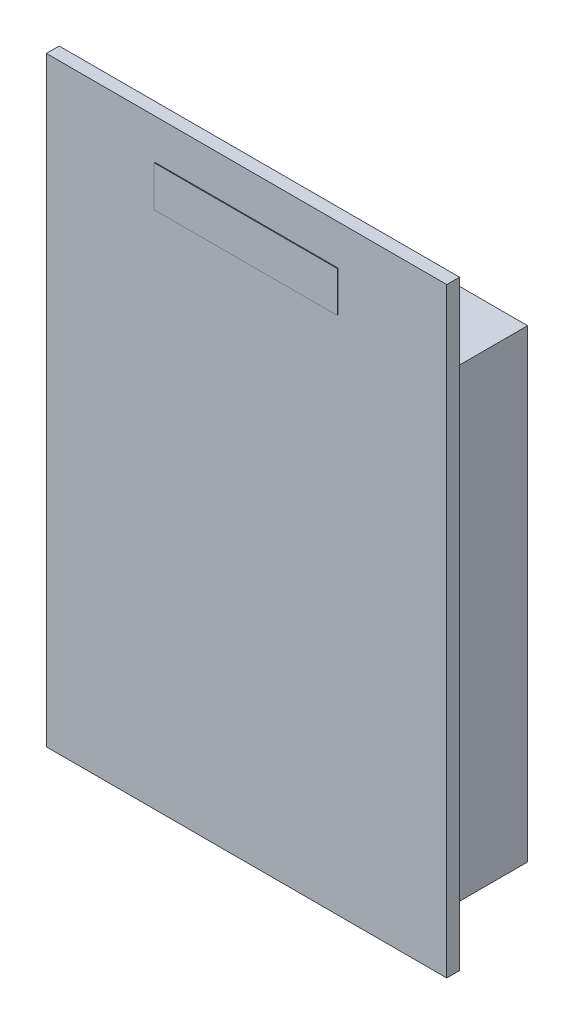
ISO-10303-21;
HEADER;
FILE_DESCRIPTION(('STEP AP214'),'2;1');
FILE_NAME('part.step','',(''),(''),'','','');
FILE_SCHEMA(('AUTOMOTIVE_DESIGN { 1 0 10303 214 1 1 1 1 }'));
ENDSEC;
DATA;
#1=APPLICATION_CONTEXT('core data for automotive mechanical design processes');
#2=APPLICATION_PROTOCOL_DEFINITION('international standard','automotive_design',2000,#1);
#3=PRODUCT_CONTEXT('',#1,'mechanical');
#4=PRODUCT('Part','Part','',(#3));
#5=PRODUCT_RELATED_PRODUCT_CATEGORY('part','',(#4));
#6=PRODUCT_DEFINITION_FORMATION('','',#4);
#7=PRODUCT_DEFINITION_CONTEXT('part definition',#1,'design');
#8=PRODUCT_DEFINITION('design','',#6,#7);
#9=PRODUCT_DEFINITION_SHAPE('','',#8);
#10=(LENGTH_UNIT() NAMED_UNIT(*) SI_UNIT(.MILLI.,.METRE.));
#11=(NAMED_UNIT(*) PLANE_ANGLE_UNIT() SI_UNIT($,.RADIAN.));
#12=(NAMED_UNIT(*) SI_UNIT($,.STERADIAN.) SOLID_ANGLE_UNIT());
#13=UNCERTAINTY_MEASURE_WITH_UNIT(LENGTH_MEASURE(1.E-05),#10,'distance_accuracy_value','');
#14=(GEOMETRIC_REPRESENTATION_CONTEXT(3) GLOBAL_UNCERTAINTY_ASSIGNED_CONTEXT((#13)) GLOBAL_UNIT_ASSIGNED_CONTEXT((#10,
#11,#12)) REPRESENTATION_CONTEXT('',''));
#15=CARTESIAN_POINT('',(0.,0.,0.));
#16=DIRECTION('',(0.,0.,1.));
#17=DIRECTION('',(1.,0.,0.));
#18=AXIS2_PLACEMENT_3D('',#15,#16,#17);
#19=CARTESIAN_POINT('',(0.,0.,0.));
#20=DIRECTION('',(0.,0.,1.));
#21=DIRECTION('',(1.,0.,0.));
#22=AXIS2_PLACEMENT_3D('',#19,#20,#21);
#23=PLANE('',#22);
#24=DIRECTION('',(0.,-1.,0.));
#25=VECTOR('',#24,1.);
#26=CARTESIAN_POINT('',(17.5,-37.5,0.));
#27=LINE('',#26,#25);
#28=CARTESIAN_POINT('',(17.5,20.5,0.));
#29=VERTEX_POINT('',#28);
#30=CARTESIAN_POINT('',(17.5,-37.5,0.));
#31=VERTEX_POINT('',#30);
#32=EDGE_CURVE('E57',#29,#31,#27,.T.);
#33=ORIENTED_EDGE('',*,*,#32,.F.);
#34=DIRECTION('',(1.,0.,0.));
#35=VECTOR('',#34,1.);
#36=CARTESIAN_POINT('',(-17.5,20.5,0.));
#37=LINE('',#36,#35);
#38=CARTESIAN_POINT('',(-17.5,20.5,0.));
#39=VERTEX_POINT('',#38);
#40=EDGE_CURVE('E151',#39,#29,#37,.T.);
#41=ORIENTED_EDGE('',*,*,#40,.F.);
#42=DIRECTION('',(0.,1.,0.));
#43=VECTOR('',#42,1.);
#44=CARTESIAN_POINT('',(-17.5,-37.5,0.));
#45=LINE('',#44,#43);
#46=CARTESIAN_POINT('',(-17.5,-37.5,0.));
#47=VERTEX_POINT('',#46);
#48=EDGE_CURVE('E258',#47,#39,#45,.T.);
#49=ORIENTED_EDGE('',*,*,#48,.F.);
#50=DIRECTION('',(1.,0.,0.));
#51=VECTOR('',#50,1.);
#52=CARTESIAN_POINT('',(25.,-37.5,0.));
#53=LINE('',#52,#51);
#54=CARTESIAN_POINT('',(-25.,-37.5,0.));
#55=VERTEX_POINT('',#54);
#56=EDGE_CURVE('E221',#55,#47,#53,.T.);
#57=ORIENTED_EDGE('',*,*,#56,.F.);
#58=DIRECTION('',(0.,-1.,0.));
#59=VECTOR('',#58,1.);
#60=CARTESIAN_POINT('',(-25.,-37.5,0.));
#61=LINE('',#60,#59);
#62=CARTESIAN_POINT('',(-25.,37.5,0.));
#63=VERTEX_POINT('',#62);
#64=EDGE_CURVE('E202',#63,#55,#61,.T.);
#65=ORIENTED_EDGE('',*,*,#64,.F.);
#66=DIRECTION('',(-1.,0.,0.));
#67=VECTOR('',#66,1.);
#68=CARTESIAN_POINT('',(25.,37.5,0.));
#69=LINE('',#68,#67);
#70=CARTESIAN_POINT('',(25.,37.5,0.));
#71=VERTEX_POINT('',#70);
#72=EDGE_CURVE('E208',#71,#63,#69,.T.);
#73=ORIENTED_EDGE('',*,*,#72,.F.);
#74=DIRECTION('',(0.,1.,0.));
#75=VECTOR('',#74,1.);
#76=CARTESIAN_POINT('',(25.,-37.5,0.));
#77=LINE('',#76,#75);
#78=CARTESIAN_POINT('',(25.,-37.5,0.));
#79=VERTEX_POINT('',#78);
#80=EDGE_CURVE('E224',#79,#71,#77,.T.);
#81=ORIENTED_EDGE('',*,*,#80,.F.);
#82=EDGE_CURVE('E62',#31,#79,#53,.T.);
#83=ORIENTED_EDGE('',*,*,#82,.F.);
#84=EDGE_LOOP('',(#33,#41,#49,#57,#65,#73,#81,#83));
#85=FACE_BOUND('',#84,.T.);
#86=ADVANCED_FACE('F41',(#85),#23,.F.);
#87=CARTESIAN_POINT('',(0.,0.,1.6));
#88=DIRECTION('',(0.,0.,1.));
#89=DIRECTION('',(1.,0.,0.));
#90=AXIS2_PLACEMENT_3D('',#87,#88,#89);
#91=PLANE('',#90);
#92=DIRECTION('',(0.,-1.,0.));
#93=VECTOR('',#92,1.);
#94=CARTESIAN_POINT('',(-25.,-37.5,1.6));
#95=LINE('',#94,#93);
#96=CARTESIAN_POINT('',(-25.,37.5,1.6));
#97=VERTEX_POINT('',#96);
#98=CARTESIAN_POINT('',(-25.,-37.5,1.6));
#99=VERTEX_POINT('',#98);
#100=EDGE_CURVE('E203',#97,#99,#95,.T.);
#101=ORIENTED_EDGE('',*,*,#100,.T.);
#102=DIRECTION('',(1.,0.,0.));
#103=VECTOR('',#102,1.);
#104=CARTESIAN_POINT('',(25.,-37.5,1.6));
#105=LINE('',#104,#103);
#106=CARTESIAN_POINT('',(25.,-37.5,1.6));
#107=VERTEX_POINT('',#106);
#108=EDGE_CURVE('E207',#99,#107,#105,.T.);
#109=ORIENTED_EDGE('',*,*,#108,.T.);
#110=DIRECTION('',(0.,1.,0.));
#111=VECTOR('',#110,1.);
#112=CARTESIAN_POINT('',(25.,-37.5,1.6));
#113=LINE('',#112,#111);
#114=CARTESIAN_POINT('',(25.,37.5,1.6));
#115=VERTEX_POINT('',#114);
#116=EDGE_CURVE('E211',#107,#115,#113,.T.);
#117=ORIENTED_EDGE('',*,*,#116,.T.);
#118=DIRECTION('',(-1.,0.,0.));
#119=VECTOR('',#118,1.);
#120=CARTESIAN_POINT('',(25.,37.5,1.6));
#121=LINE('',#120,#119);
#122=EDGE_CURVE('E214',#115,#97,#121,.T.);
#123=ORIENTED_EDGE('',*,*,#122,.T.);
#124=EDGE_LOOP('',(#101,#109,#117,#123));
#125=FACE_BOUND('',#124,.T.);
#126=DIRECTION('',(-1.,0.,0.));
#127=VECTOR('',#126,1.);
#128=CARTESIAN_POINT('',(-11.43,32.5,1.6));
#129=LINE('',#128,#127);
#130=CARTESIAN_POINT('',(11.43,32.5,1.6));
#131=VERTEX_POINT('',#130);
#132=CARTESIAN_POINT('',(-11.43,32.5,1.6));
#133=VERTEX_POINT('',#132);
#134=EDGE_CURVE('E160',#131,#133,#129,.T.);
#135=ORIENTED_EDGE('',*,*,#134,.F.);
#136=DIRECTION('',(0.,1.,0.));
#137=VECTOR('',#136,1.);
#138=CARTESIAN_POINT('',(11.43,27.42,1.6));
#139=LINE('',#138,#137);
#140=CARTESIAN_POINT('',(11.43,27.42,1.6));
#141=VERTEX_POINT('',#140);
#142=EDGE_CURVE('E155',#141,#131,#139,.T.);
#143=ORIENTED_EDGE('',*,*,#142,.F.);
#144=DIRECTION('',(1.,0.,0.));
#145=VECTOR('',#144,1.);
#146=CARTESIAN_POINT('',(-11.43,27.42,1.6));
#147=LINE('',#146,#145);
#148=CARTESIAN_POINT('',(-11.43,27.42,1.6));
#149=VERTEX_POINT('',#148);
#150=EDGE_CURVE('E171',#149,#141,#147,.T.);
#151=ORIENTED_EDGE('',*,*,#150,.F.);
#152=DIRECTION('',(0.,-1.,0.));
#153=VECTOR('',#152,1.);
#154=CARTESIAN_POINT('',(-11.43,27.42,1.6));
#155=LINE('',#154,#153);
#156=EDGE_CURVE('E183',#133,#149,#155,.T.);
#157=ORIENTED_EDGE('',*,*,#156,.F.);
#158=EDGE_LOOP('',(#135,#143,#151,#157));
#159=FACE_BOUND('',#158,.T.);
#160=ADVANCED_FACE('F252',(#125,#159),#91,.T.);
#161=CARTESIAN_POINT('',(-25.,-37.5,1.6));
#162=DIRECTION('',(1.,0.,0.));
#163=DIRECTION('',(0.,0.,-1.));
#164=AXIS2_PLACEMENT_3D('',#161,#162,#163);
#165=PLANE('',#164);
#166=ORIENTED_EDGE('',*,*,#64,.T.);
#167=DIRECTION('',(0.,0.,-1.));
#168=VECTOR('',#167,1.);
#169=CARTESIAN_POINT('',(-25.,-37.5,1.6));
#170=LINE('',#169,#168);
#171=EDGE_CURVE('E11',#99,#55,#170,.T.);
#172=ORIENTED_EDGE('',*,*,#171,.F.);
#173=ORIENTED_EDGE('',*,*,#100,.F.);
#174=DIRECTION('',(0.,0.,-1.));
#175=VECTOR('',#174,1.);
#176=CARTESIAN_POINT('',(-25.,37.5,1.6));
#177=LINE('',#176,#175);
#178=EDGE_CURVE('E217',#97,#63,#177,.T.);
#179=ORIENTED_EDGE('',*,*,#178,.T.);
#180=EDGE_LOOP('',(#166,#172,#173,#179));
#181=FACE_BOUND('',#180,.T.);
#182=ADVANCED_FACE('F43',(#181),#165,.F.);
#183=CARTESIAN_POINT('',(25.,-37.5,1.6));
#184=DIRECTION('',(0.,1.,0.));
#185=DIRECTION('',(0.,0.,1.));
#186=AXIS2_PLACEMENT_3D('',#183,#184,#185);
#187=PLANE('',#186);
#188=ORIENTED_EDGE('',*,*,#56,.T.);
#189=DIRECTION('',(0.,0.,1.));
#190=VECTOR('',#189,1.);
#191=CARTESIAN_POINT('',(-17.5,-37.5,-16.));
#192=LINE('',#191,#190);
#193=CARTESIAN_POINT('',(-17.5,-37.5,-16.));
#194=VERTEX_POINT('',#193);
#195=EDGE_CURVE('E136',#194,#47,#192,.T.);
#196=ORIENTED_EDGE('',*,*,#195,.F.);
#197=DIRECTION('',(-1.,0.,0.));
#198=VECTOR('',#197,1.);
#199=CARTESIAN_POINT('',(-17.5,-37.5,-16.));
#200=LINE('',#199,#198);
#201=CARTESIAN_POINT('',(17.5,-37.5,-16.));
#202=VERTEX_POINT('',#201);
#203=EDGE_CURVE('E129',#202,#194,#200,.T.);
#204=ORIENTED_EDGE('',*,*,#203,.F.);
#205=DIRECTION('',(0.,0.,1.));
#206=VECTOR('',#205,1.);
#207=CARTESIAN_POINT('',(17.5,-37.5,-16.));
#208=LINE('',#207,#206);
#209=EDGE_CURVE('E134',#202,#31,#208,.T.);
#210=ORIENTED_EDGE('',*,*,#209,.T.);
#211=ORIENTED_EDGE('',*,*,#82,.T.);
#212=DIRECTION('',(0.,0.,-1.));
#213=VECTOR('',#212,1.);
#214=CARTESIAN_POINT('',(25.,-37.5,1.6));
#215=LINE('',#214,#213);
#216=EDGE_CURVE('E50',#107,#79,#215,.T.);
#217=ORIENTED_EDGE('',*,*,#216,.F.);
#218=ORIENTED_EDGE('',*,*,#108,.F.);
#219=ORIENTED_EDGE('',*,*,#171,.T.);
#220=EDGE_LOOP('',(#188,#196,#204,#210,#211,#217,#218,#219));
#221=FACE_BOUND('',#220,.T.);
#222=ADVANCED_FACE('F132',(#221),#187,.F.);
#223=CARTESIAN_POINT('',(25.,-37.5,1.6));
#224=DIRECTION('',(-1.,0.,0.));
#225=DIRECTION('',(0.,0.,1.));
#226=AXIS2_PLACEMENT_3D('',#223,#224,#225);
#227=PLANE('',#226);
#228=ORIENTED_EDGE('',*,*,#80,.T.);
#229=DIRECTION('',(0.,0.,-1.));
#230=VECTOR('',#229,1.);
#231=CARTESIAN_POINT('',(25.,37.5,1.6));
#232=LINE('',#231,#230);
#233=EDGE_CURVE('E232',#115,#71,#232,.T.);
#234=ORIENTED_EDGE('',*,*,#233,.F.);
#235=ORIENTED_EDGE('',*,*,#116,.F.);
#236=ORIENTED_EDGE('',*,*,#216,.T.);
#237=EDGE_LOOP('',(#228,#234,#235,#236));
#238=FACE_BOUND('',#237,.T.);
#239=ADVANCED_FACE('F240',(#238),#227,.F.);
#240=CARTESIAN_POINT('',(25.,37.5,1.6));
#241=DIRECTION('',(0.,-1.,0.));
#242=DIRECTION('',(0.,0.,-1.));
#243=AXIS2_PLACEMENT_3D('',#240,#241,#242);
#244=PLANE('',#243);
#245=ORIENTED_EDGE('',*,*,#72,.T.);
#246=ORIENTED_EDGE('',*,*,#178,.F.);
#247=ORIENTED_EDGE('',*,*,#122,.F.);
#248=ORIENTED_EDGE('',*,*,#233,.T.);
#249=EDGE_LOOP('',(#245,#246,#247,#248));
#250=FACE_BOUND('',#249,.T.);
#251=ADVANCED_FACE('F246',(#250),#244,.F.);
#252=CARTESIAN_POINT('',(11.43,27.42,1.7));
#253=DIRECTION('',(-1.,0.,0.));
#254=DIRECTION('',(0.,0.,1.));
#255=AXIS2_PLACEMENT_3D('',#252,#253,#254);
#256=PLANE('',#255);
#257=ORIENTED_EDGE('',*,*,#142,.T.);
#258=DIRECTION('',(0.,0.,-1.));
#259=VECTOR('',#258,1.);
#260=CARTESIAN_POINT('',(11.43,32.5,1.7));
#261=LINE('',#260,#259);
#262=CARTESIAN_POINT('',(11.43,32.5,1.7));
#263=VERTEX_POINT('',#262);
#264=EDGE_CURVE('E199',#263,#131,#261,.T.);
#265=ORIENTED_EDGE('',*,*,#264,.F.);
#266=DIRECTION('',(0.,1.,0.));
#267=VECTOR('',#266,1.);
#268=CARTESIAN_POINT('',(11.43,27.42,1.7));
#269=LINE('',#268,#267);
#270=CARTESIAN_POINT('',(11.43,27.42,1.7));
#271=VERTEX_POINT('',#270);
#272=EDGE_CURVE('E166',#271,#263,#269,.T.);
#273=ORIENTED_EDGE('',*,*,#272,.F.);
#274=DIRECTION('',(0.,0.,-1.));
#275=VECTOR('',#274,1.);
#276=CARTESIAN_POINT('',(11.43,27.42,1.7));
#277=LINE('',#276,#275);
#278=EDGE_CURVE('E179',#271,#141,#277,.T.);
#279=ORIENTED_EDGE('',*,*,#278,.T.);
#280=EDGE_LOOP('',(#257,#265,#273,#279));
#281=FACE_BOUND('',#280,.T.);
#282=ADVANCED_FACE('F294',(#281),#256,.F.);
#283=CARTESIAN_POINT('',(-11.43,32.5,1.7));
#284=DIRECTION('',(0.,-1.,0.));
#285=DIRECTION('',(0.,0.,-1.));
#286=AXIS2_PLACEMENT_3D('',#283,#284,#285);
#287=PLANE('',#286);
#288=ORIENTED_EDGE('',*,*,#134,.T.);
#289=DIRECTION('',(0.,0.,-1.));
#290=VECTOR('',#289,1.);
#291=CARTESIAN_POINT('',(-11.43,32.5,1.7));
#292=LINE('',#291,#290);
#293=CARTESIAN_POINT('',(-11.43,32.5,1.7));
#294=VERTEX_POINT('',#293);
#295=EDGE_CURVE('E195',#294,#133,#292,.T.);
#296=ORIENTED_EDGE('',*,*,#295,.F.);
#297=DIRECTION('',(-1.,0.,0.));
#298=VECTOR('',#297,1.);
#299=CARTESIAN_POINT('',(-11.43,32.5,1.7));
#300=LINE('',#299,#298);
#301=EDGE_CURVE('E170',#263,#294,#300,.T.);
#302=ORIENTED_EDGE('',*,*,#301,.F.);
#303=ORIENTED_EDGE('',*,*,#264,.T.);
#304=EDGE_LOOP('',(#288,#296,#302,#303));
#305=FACE_BOUND('',#304,.T.);
#306=ADVANCED_FACE('F319',(#305),#287,.F.);
#307=CARTESIAN_POINT('',(-11.43,27.42,1.7));
#308=DIRECTION('',(1.,0.,0.));
#309=DIRECTION('',(0.,0.,-1.));
#310=AXIS2_PLACEMENT_3D('',#307,#308,#309);
#311=PLANE('',#310);
#312=ORIENTED_EDGE('',*,*,#156,.T.);
#313=DIRECTION('',(0.,0.,-1.));
#314=VECTOR('',#313,1.);
#315=CARTESIAN_POINT('',(-11.43,27.42,1.7));
#316=LINE('',#315,#314);
#317=CARTESIAN_POINT('',(-11.43,27.42,1.7));
#318=VERTEX_POINT('',#317);
#319=EDGE_CURVE('E192',#318,#149,#316,.T.);
#320=ORIENTED_EDGE('',*,*,#319,.F.);
#321=DIRECTION('',(0.,-1.,0.));
#322=VECTOR('',#321,1.);
#323=CARTESIAN_POINT('',(-11.43,27.42,1.7));
#324=LINE('',#323,#322);
#325=EDGE_CURVE('E174',#294,#318,#324,.T.);
#326=ORIENTED_EDGE('',*,*,#325,.F.);
#327=ORIENTED_EDGE('',*,*,#295,.T.);
#328=EDGE_LOOP('',(#312,#320,#326,#327));
#329=FACE_BOUND('',#328,.T.);
#330=ADVANCED_FACE('F328',(#329),#311,.F.);
#331=CARTESIAN_POINT('',(-11.43,27.42,1.7));
#332=DIRECTION('',(0.,1.,0.));
#333=DIRECTION('',(0.,0.,1.));
#334=AXIS2_PLACEMENT_3D('',#331,#332,#333);
#335=PLANE('',#334);
#336=ORIENTED_EDGE('',*,*,#150,.T.);
#337=ORIENTED_EDGE('',*,*,#278,.F.);
#338=DIRECTION('',(1.,0.,0.));
#339=VECTOR('',#338,1.);
#340=CARTESIAN_POINT('',(-11.43,27.42,1.7));
#341=LINE('',#340,#339);
#342=EDGE_CURVE('E177',#318,#271,#341,.T.);
#343=ORIENTED_EDGE('',*,*,#342,.F.);
#344=ORIENTED_EDGE('',*,*,#319,.T.);
#345=EDGE_LOOP('',(#336,#337,#343,#344));
#346=FACE_BOUND('',#345,.T.);
#347=ADVANCED_FACE('F338',(#346),#335,.F.);
#348=CARTESIAN_POINT('',(0.,0.,1.7));
#349=DIRECTION('',(0.,0.,-1.));
#350=DIRECTION('',(-1.,0.,0.));
#351=AXIS2_PLACEMENT_3D('',#348,#349,#350);
#352=PLANE('',#351);
#353=ORIENTED_EDGE('',*,*,#272,.T.);
#354=ORIENTED_EDGE('',*,*,#301,.T.);
#355=ORIENTED_EDGE('',*,*,#325,.T.);
#356=ORIENTED_EDGE('',*,*,#342,.T.);
#357=EDGE_LOOP('',(#353,#354,#355,#356));
#358=FACE_BOUND('',#357,.T.);
#359=ADVANCED_FACE('F348',(#358),#352,.F.);
#360=CARTESIAN_POINT('',(17.5,-37.5,-16.));
#361=DIRECTION('',(-1.,0.,0.));
#362=DIRECTION('',(0.,0.,1.));
#363=AXIS2_PLACEMENT_3D('',#360,#361,#362);
#364=PLANE('',#363);
#365=ORIENTED_EDGE('',*,*,#32,.T.);
#366=ORIENTED_EDGE('',*,*,#209,.F.);
#367=DIRECTION('',(0.,-1.,0.));
#368=VECTOR('',#367,1.);
#369=CARTESIAN_POINT('',(17.5,-37.5,-16.));
#370=LINE('',#369,#368);
#371=CARTESIAN_POINT('',(17.5,20.5,-16.));
#372=VERTEX_POINT('',#371);
#373=EDGE_CURVE('E141',#372,#202,#370,.T.);
#374=ORIENTED_EDGE('',*,*,#373,.F.);
#375=DIRECTION('',(0.,0.,1.));
#376=VECTOR('',#375,1.);
#377=CARTESIAN_POINT('',(17.5,20.5,-16.));
#378=LINE('',#377,#376);
#379=EDGE_CURVE('E263',#372,#29,#378,.T.);
#380=ORIENTED_EDGE('',*,*,#379,.T.);
#381=EDGE_LOOP('',(#365,#366,#374,#380));
#382=FACE_BOUND('',#381,.T.);
#383=ADVANCED_FACE('F153',(#382),#364,.F.);
#384=CARTESIAN_POINT('',(-17.5,-37.5,-16.));
#385=DIRECTION('',(1.,0.,0.));
#386=DIRECTION('',(0.,0.,-1.));
#387=AXIS2_PLACEMENT_3D('',#384,#385,#386);
#388=PLANE('',#387);
#389=ORIENTED_EDGE('',*,*,#48,.T.);
#390=DIRECTION('',(0.,0.,1.));
#391=VECTOR('',#390,1.);
#392=CARTESIAN_POINT('',(-17.5,20.5,-16.));
#393=LINE('',#392,#391);
#394=CARTESIAN_POINT('',(-17.5,20.5,-16.));
#395=VERTEX_POINT('',#394);
#396=EDGE_CURVE('E162',#395,#39,#393,.T.);
#397=ORIENTED_EDGE('',*,*,#396,.F.);
#398=DIRECTION('',(0.,1.,0.));
#399=VECTOR('',#398,1.);
#400=CARTESIAN_POINT('',(-17.5,-37.5,-16.));
#401=LINE('',#400,#399);
#402=EDGE_CURVE('E140',#194,#395,#401,.T.);
#403=ORIENTED_EDGE('',*,*,#402,.F.);
#404=ORIENTED_EDGE('',*,*,#195,.T.);
#405=EDGE_LOOP('',(#389,#397,#403,#404));
#406=FACE_BOUND('',#405,.T.);
#407=ADVANCED_FACE('F256',(#406),#388,.F.);
#408=CARTESIAN_POINT('',(-17.5,20.5,-16.));
#409=DIRECTION('',(0.,-1.,0.));
#410=DIRECTION('',(1.,0.,0.));
#411=AXIS2_PLACEMENT_3D('',#408,#409,#410);
#412=PLANE('',#411);
#413=ORIENTED_EDGE('',*,*,#40,.T.);
#414=ORIENTED_EDGE('',*,*,#379,.F.);
#415=DIRECTION('',(1.,0.,0.));
#416=VECTOR('',#415,1.);
#417=CARTESIAN_POINT('',(-17.5,20.5,-16.));
#418=LINE('',#417,#416);
#419=EDGE_CURVE('E146',#395,#372,#418,.T.);
#420=ORIENTED_EDGE('',*,*,#419,.F.);
#421=ORIENTED_EDGE('',*,*,#396,.T.);
#422=EDGE_LOOP('',(#413,#414,#420,#421));
#423=FACE_BOUND('',#422,.T.);
#424=ADVANCED_FACE('F275',(#423),#412,.F.);
#425=CARTESIAN_POINT('',(0.,0.,-16.));
#426=DIRECTION('',(0.,0.,-1.));
#427=DIRECTION('',(-1.,0.,0.));
#428=AXIS2_PLACEMENT_3D('',#425,#426,#427);
#429=PLANE('',#428);
#430=ORIENTED_EDGE('',*,*,#373,.T.);
#431=ORIENTED_EDGE('',*,*,#203,.T.);
#432=ORIENTED_EDGE('',*,*,#402,.T.);
#433=ORIENTED_EDGE('',*,*,#419,.T.);
#434=EDGE_LOOP('',(#430,#431,#432,#433));
#435=FACE_BOUND('',#434,.T.);
#436=ADVANCED_FACE('F144',(#435),#429,.T.);
#437=CLOSED_SHELL('',(#86,#160,#182,#222,#239,#251,#282,#306,#330,#347,#359,#383,#407,#424,#436));
#438=MANIFOLD_SOLID_BREP('B2',#437);
#439=ADVANCED_BREP_SHAPE_REPRESENTATION('',(#18,#438),#14);
#440=SHAPE_DEFINITION_REPRESENTATION(#9,#439);
ENDSEC;
END-ISO-10303-21;
